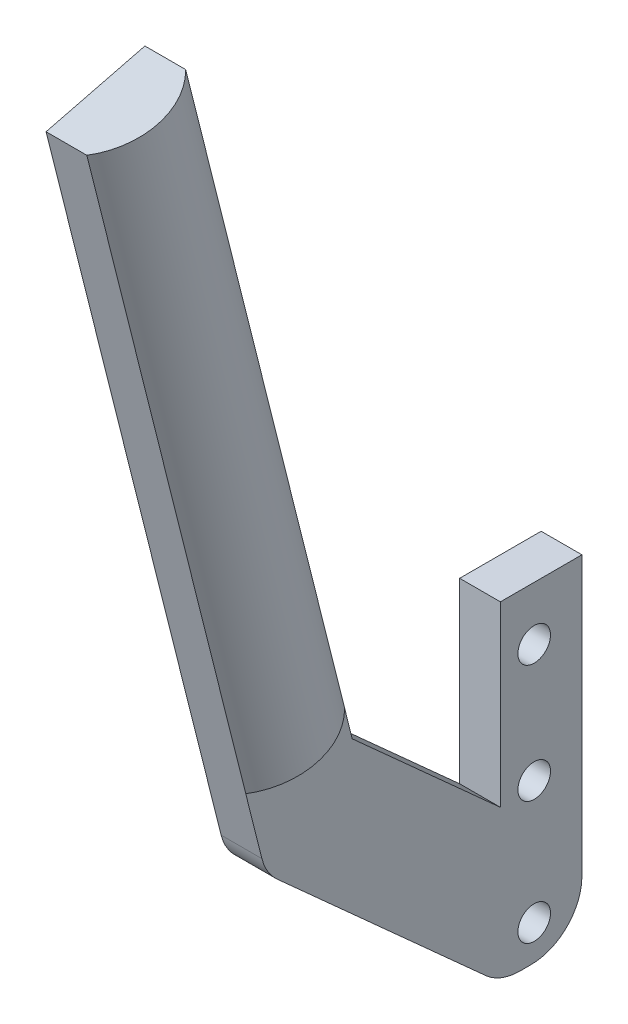
ISO-10303-21;
HEADER;
FILE_DESCRIPTION(('STEP AP214'),'2;1');
FILE_NAME('part.step','',(''),(''),'','','');
FILE_SCHEMA(('AUTOMOTIVE_DESIGN { 1 0 10303 214 1 1 1 1 }'));
ENDSEC;
DATA;
#1=APPLICATION_CONTEXT('core data for automotive mechanical design processes');
#2=APPLICATION_PROTOCOL_DEFINITION('international standard','automotive_design',2000,#1);
#3=PRODUCT_CONTEXT('',#1,'mechanical');
#4=PRODUCT('Part','Part','',(#3));
#5=PRODUCT_RELATED_PRODUCT_CATEGORY('part','',(#4));
#6=PRODUCT_DEFINITION_FORMATION('','',#4);
#7=PRODUCT_DEFINITION_CONTEXT('part definition',#1,'design');
#8=PRODUCT_DEFINITION('design','',#6,#7);
#9=PRODUCT_DEFINITION_SHAPE('','',#8);
#10=(LENGTH_UNIT() NAMED_UNIT(*) SI_UNIT(.MILLI.,.METRE.));
#11=(NAMED_UNIT(*) PLANE_ANGLE_UNIT() SI_UNIT($,.RADIAN.));
#12=(NAMED_UNIT(*) SI_UNIT($,.STERADIAN.) SOLID_ANGLE_UNIT());
#13=UNCERTAINTY_MEASURE_WITH_UNIT(LENGTH_MEASURE(1.E-05),#10,'distance_accuracy_value','');
#14=(GEOMETRIC_REPRESENTATION_CONTEXT(3) GLOBAL_UNCERTAINTY_ASSIGNED_CONTEXT((#13)) GLOBAL_UNIT_ASSIGNED_CONTEXT((#10,
#11,#12)) REPRESENTATION_CONTEXT('',''));
#15=CARTESIAN_POINT('',(0.,0.,0.));
#16=DIRECTION('',(0.,0.,1.));
#17=DIRECTION('',(1.,0.,0.));
#18=AXIS2_PLACEMENT_3D('',#15,#16,#17);
#19=CARTESIAN_POINT('',(13.5,-15.5,10.));
#20=DIRECTION('',(0.,-1.,0.));
#21=DIRECTION('',(1.,0.,0.));
#22=AXIS2_PLACEMENT_3D('',#19,#20,#21);
#23=PLANE('',#22);
#24=DIRECTION('',(0.,0.,-1.));
#25=VECTOR('',#24,1.);
#26=CARTESIAN_POINT('',(16.5,-15.5,10.));
#27=LINE('',#26,#25);
#28=CARTESIAN_POINT('',(16.5,-15.5,8.08085446230584));
#29=VERTEX_POINT('',#28);
#30=CARTESIAN_POINT('',(16.5,-15.5,7.));
#31=VERTEX_POINT('',#30);
#32=EDGE_CURVE('E250',#29,#31,#27,.T.);
#33=ORIENTED_EDGE('',*,*,#32,.T.);
#34=DIRECTION('',(-1.,0.,0.));
#35=VECTOR('',#34,1.);
#36=CARTESIAN_POINT('',(20.5,-15.5,7.));
#37=LINE('',#36,#35);
#38=CARTESIAN_POINT('',(20.5,-15.5,7.));
#39=VERTEX_POINT('',#38);
#40=EDGE_CURVE('E232',#31,#39,#37,.F.);
#41=ORIENTED_EDGE('',*,*,#40,.T.);
#42=DIRECTION('',(0.,0.,-1.));
#43=VECTOR('',#42,1.);
#44=CARTESIAN_POINT('',(20.5,-15.5,0.));
#45=LINE('',#44,#43);
#46=CARTESIAN_POINT('',(20.5,-15.5,8.08085446230584));
#47=VERTEX_POINT('',#46);
#48=EDGE_CURVE('E171',#47,#39,#45,.T.);
#49=ORIENTED_EDGE('',*,*,#48,.F.);
#50=DIRECTION('',(-1.,0.,0.));
#51=VECTOR('',#50,1.);
#52=CARTESIAN_POINT('',(13.5,-15.5,8.08085446230584));
#53=LINE('',#52,#51);
#54=EDGE_CURVE('E229',#47,#29,#53,.T.);
#55=ORIENTED_EDGE('',*,*,#54,.T.);
#56=EDGE_LOOP('',(#33,#41,#49,#55));
#57=FACE_BOUND('',#56,.T.);
#58=ADVANCED_FACE('F37',(#57),#23,.T.);
#59=CARTESIAN_POINT('',(-124.5,11.5751536993855,6.68185993922691));
#60=DIRECTION('',(1.,0.,0.));
#61=DIRECTION('',(0.,0.,-1.));
#62=AXIS2_PLACEMENT_3D('',#59,#60,#61);
#63=CYLINDRICAL_SURFACE('',#62,1.6);
#64=CARTESIAN_POINT('',(20.5,11.5751536993855,6.68185993922691));
#65=DIRECTION('',(1.,0.,0.));
#66=DIRECTION('',(0.,0.,-1.));
#67=AXIS2_PLACEMENT_3D('',#64,#65,#66);
#68=CIRCLE('',#67,1.6);
#69=CARTESIAN_POINT('',(20.5,11.5751536993855,5.08185993922691));
#70=VERTEX_POINT('',#69);
#71=EDGE_CURVE('E177',#70,#70,#68,.F.);
#72=ORIENTED_EDGE('',*,*,#71,.F.);
#73=EDGE_LOOP('',(#72));
#74=FACE_BOUND('',#73,.T.);
#75=CARTESIAN_POINT('',(16.5,11.5751536993855,6.68185993922691));
#76=DIRECTION('',(-1.,0.,0.));
#77=DIRECTION('',(0.,0.,1.));
#78=AXIS2_PLACEMENT_3D('',#75,#76,#77);
#79=CIRCLE('',#78,1.6);
#80=CARTESIAN_POINT('',(16.5,11.5751536993855,8.28185993922691));
#81=VERTEX_POINT('',#80);
#82=EDGE_CURVE('E188',#81,#81,#79,.F.);
#83=ORIENTED_EDGE('',*,*,#82,.F.);
#84=EDGE_LOOP('',(#83));
#85=FACE_BOUND('',#84,.T.);
#86=ADVANCED_FACE('F302',(#74,#85),#63,.F.);
#87=CARTESIAN_POINT('',(-124.5,-12.0698183873928,6.68185993922691));
#88=DIRECTION('',(1.,0.,0.));
#89=DIRECTION('',(0.,0.,-1.));
#90=AXIS2_PLACEMENT_3D('',#87,#88,#89);
#91=CYLINDRICAL_SURFACE('',#90,1.6);
#92=CARTESIAN_POINT('',(20.5,-12.0698183873928,6.68185993922691));
#93=DIRECTION('',(1.,0.,0.));
#94=DIRECTION('',(0.,0.,-1.));
#95=AXIS2_PLACEMENT_3D('',#92,#93,#94);
#96=CIRCLE('',#95,1.6);
#97=CARTESIAN_POINT('',(20.5,-12.0698183873928,5.08185993922691));
#98=VERTEX_POINT('',#97);
#99=EDGE_CURVE('E198',#98,#98,#96,.F.);
#100=ORIENTED_EDGE('',*,*,#99,.F.);
#101=EDGE_LOOP('',(#100));
#102=FACE_BOUND('',#101,.T.);
#103=CARTESIAN_POINT('',(16.5,-12.0698183873928,6.68185993922691));
#104=DIRECTION('',(-1.,0.,0.));
#105=DIRECTION('',(0.,0.,1.));
#106=AXIS2_PLACEMENT_3D('',#103,#104,#105);
#107=CIRCLE('',#106,1.6);
#108=CARTESIAN_POINT('',(16.5,-12.0698183873928,8.28185993922691));
#109=VERTEX_POINT('',#108);
#110=EDGE_CURVE('E289',#109,#109,#107,.F.);
#111=ORIENTED_EDGE('',*,*,#110,.F.);
#112=EDGE_LOOP('',(#111));
#113=FACE_BOUND('',#112,.T.);
#114=ADVANCED_FACE('F298',(#102,#113),#91,.F.);
#115=CARTESIAN_POINT('',(-124.5,0.,6.68185993922691));
#116=DIRECTION('',(1.,0.,0.));
#117=DIRECTION('',(0.,0.,-1.));
#118=AXIS2_PLACEMENT_3D('',#115,#116,#117);
#119=CYLINDRICAL_SURFACE('',#118,1.6);
#120=CARTESIAN_POINT('',(20.5,0.,6.68185993922691));
#121=DIRECTION('',(1.,0.,0.));
#122=DIRECTION('',(0.,0.,-1.));
#123=AXIS2_PLACEMENT_3D('',#120,#121,#122);
#124=CIRCLE('',#123,1.6);
#125=CARTESIAN_POINT('',(20.5,0.,5.08185993922691));
#126=VERTEX_POINT('',#125);
#127=EDGE_CURVE('E180',#126,#126,#124,.F.);
#128=ORIENTED_EDGE('',*,*,#127,.F.);
#129=EDGE_LOOP('',(#128));
#130=FACE_BOUND('',#129,.T.);
#131=CARTESIAN_POINT('',(16.5,0.,6.68185993922691));
#132=DIRECTION('',(-1.,0.,0.));
#133=DIRECTION('',(0.,0.,1.));
#134=AXIS2_PLACEMENT_3D('',#131,#132,#133);
#135=CIRCLE('',#134,1.6);
#136=CARTESIAN_POINT('',(16.5,0.,8.28185993922691));
#137=VERTEX_POINT('',#136);
#138=EDGE_CURVE('E286',#137,#137,#135,.F.);
#139=ORIENTED_EDGE('',*,*,#138,.F.);
#140=EDGE_LOOP('',(#139));
#141=FACE_BOUND('',#140,.T.);
#142=ADVANCED_FACE('F301',(#130,#141),#119,.F.);
#143=CARTESIAN_POINT('',(20.5,0.,10.));
#144=DIRECTION('',(0.,0.,-1.));
#145=DIRECTION('',(-1.,0.,0.));
#146=AXIS2_PLACEMENT_3D('',#143,#144,#145);
#147=PLANE('',#146);
#148=DIRECTION('',(0.,-1.,0.));
#149=VECTOR('',#148,1.);
#150=CARTESIAN_POINT('',(16.5,15.5,10.));
#151=LINE('',#150,#149);
#152=CARTESIAN_POINT('',(16.5,16.8452873223447,10.));
#153=VERTEX_POINT('',#152);
#154=CARTESIAN_POINT('',(16.5,-0.619784933226779,10.));
#155=VERTEX_POINT('',#154);
#156=EDGE_CURVE('E212',#153,#155,#151,.T.);
#157=ORIENTED_EDGE('',*,*,#156,.T.);
#158=DIRECTION('',(-1.,0.,0.));
#159=VECTOR('',#158,1.);
#160=CARTESIAN_POINT('',(20.5,-0.619784933226779,10.));
#161=LINE('',#160,#159);
#162=CARTESIAN_POINT('',(20.5,-0.619784933226779,10.));
#163=VERTEX_POINT('',#162);
#164=EDGE_CURVE('E210',#163,#155,#161,.T.);
#165=ORIENTED_EDGE('',*,*,#164,.F.);
#166=DIRECTION('',(0.,-1.,0.));
#167=VECTOR('',#166,1.);
#168=CARTESIAN_POINT('',(20.5,0.,10.));
#169=LINE('',#168,#167);
#170=CARTESIAN_POINT('',(20.5,16.8452873223447,10.));
#171=VERTEX_POINT('',#170);
#172=EDGE_CURVE('E271',#171,#163,#169,.T.);
#173=ORIENTED_EDGE('',*,*,#172,.F.);
#174=DIRECTION('',(-1.,0.,0.));
#175=VECTOR('',#174,1.);
#176=CARTESIAN_POINT('',(20.5,16.8452873223447,10.));
#177=LINE('',#176,#175);
#178=EDGE_CURVE('E183',#171,#153,#177,.T.);
#179=ORIENTED_EDGE('',*,*,#178,.T.);
#180=EDGE_LOOP('',(#157,#165,#173,#179));
#181=FACE_BOUND('',#180,.T.);
#182=ADVANCED_FACE('F274',(#181),#147,.F.);
#183=CARTESIAN_POINT('',(20.5,-5.31486837665205,4.784943075451));
#184=DIRECTION('',(0.,0.743185563713064,-0.669085359194547));
#185=DIRECTION('',(0.,0.669085359194547,0.743185563713064));
#186=AXIS2_PLACEMENT_3D('',#183,#184,#185);
#187=PLANE('',#186);
#188=DIRECTION('',(0.,-0.669085359194547,-0.743185563713064));
#189=VECTOR('',#188,1.);
#190=CARTESIAN_POINT('',(16.5,-5.31486837665205,4.784943075451));
#191=LINE('',#190,#189);
#192=CARTESIAN_POINT('',(16.5,12.4720171727406,24.5416996418154));
#193=VERTEX_POINT('',#192);
#194=EDGE_CURVE('E184',#193,#155,#191,.T.);
#195=ORIENTED_EDGE('',*,*,#194,.F.);
#196=DIRECTION('',(-1.,0.,0.));
#197=VECTOR('',#196,1.);
#198=CARTESIAN_POINT('',(20.5,12.4720171727406,24.5416996418154));
#199=LINE('',#198,#197);
#200=CARTESIAN_POINT('',(20.5,12.4720171727406,24.5416996418154));
#201=VERTEX_POINT('',#200);
#202=EDGE_CURVE('E208',#201,#193,#199,.T.);
#203=ORIENTED_EDGE('',*,*,#202,.F.);
#204=DIRECTION('',(0.,-0.669085359194547,-0.743185563713064));
#205=VECTOR('',#204,1.);
#206=CARTESIAN_POINT('',(20.5,-5.31486837665205,4.784943075451));
#207=LINE('',#206,#205);
#208=EDGE_CURVE('E156',#201,#163,#207,.T.);
#209=ORIENTED_EDGE('',*,*,#208,.T.);
#210=ORIENTED_EDGE('',*,*,#164,.T.);
#211=EDGE_LOOP('',(#195,#203,#209,#210));
#212=FACE_BOUND('',#211,.T.);
#213=ADVANCED_FACE('F277',(#212),#187,.T.);
#214=CARTESIAN_POINT('',(20.5,-5.05991369015755,20.136197768659));
#215=DIRECTION('',(0.,0.243707906273157,-0.969848677072849));
#216=DIRECTION('',(0.,0.969848677072849,0.243707906273157));
#217=AXIS2_PLACEMENT_3D('',#214,#215,#216);
#218=PLANE('',#217);
#219=DIRECTION('',(0.,-0.969848677072848,-0.243707906273157));
#220=VECTOR('',#219,1.);
#221=CARTESIAN_POINT('',(16.5,-5.05991369015755,20.136197768659));
#222=LINE('',#221,#220);
#223=CARTESIAN_POINT('',(16.5,77.5343188438326,40.8908453306364));
#224=VERTEX_POINT('',#223);
#225=EDGE_CURVE('E187',#224,#193,#222,.T.);
#226=ORIENTED_EDGE('',*,*,#225,.F.);
#227=DIRECTION('',(-1.,0.,0.));
#228=VECTOR('',#227,1.);
#229=CARTESIAN_POINT('',(20.5,77.5343188438326,40.8908453306364));
#230=LINE('',#229,#228);
#231=CARTESIAN_POINT('',(20.5,77.5343188438326,40.8908453306364));
#232=VERTEX_POINT('',#231);
#233=EDGE_CURVE('E163',#232,#224,#230,.T.);
#234=ORIENTED_EDGE('',*,*,#233,.F.);
#235=DIRECTION('',(0.,-0.969848677072848,-0.243707906273157));
#236=VECTOR('',#235,1.);
#237=CARTESIAN_POINT('',(20.5,-5.05991369015755,20.136197768659));
#238=LINE('',#237,#236);
#239=CARTESIAN_POINT('',(20.5,15.4640035111703,25.2935393291544));
#240=VERTEX_POINT('',#239);
#241=EDGE_CURVE('E138',#232,#240,#238,.T.);
#242=ORIENTED_EDGE('',*,*,#241,.T.);
#243=EDGE_CURVE('E151',#240,#201,#238,.T.);
#244=ORIENTED_EDGE('',*,*,#243,.T.);
#245=ORIENTED_EDGE('',*,*,#202,.T.);
#246=EDGE_LOOP('',(#226,#234,#242,#244,#245));
#247=FACE_BOUND('',#246,.T.);
#248=ADVANCED_FACE('F162',(#247),#218,.T.);
#249=CARTESIAN_POINT('',(20.5,82.5942325339901,20.7546475619774));
#250=DIRECTION('',(0.,0.969848677072848,0.243707906273157));
#251=DIRECTION('',(0.,-0.243707906273157,0.969848677072848));
#252=AXIS2_PLACEMENT_3D('',#249,#250,#251);
#253=PLANE('',#252);
#254=DIRECTION('',(0.,0.243707906273157,-0.969848677072848));
#255=VECTOR('',#254,1.);
#256=CARTESIAN_POINT('',(16.5,82.5942325339901,20.7546475619774));
#257=LINE('',#256,#255);
#258=CARTESIAN_POINT('',(16.5,75.097239781101,50.5893321013648));
#259=VERTEX_POINT('',#258);
#260=EDGE_CURVE('E190',#259,#224,#257,.T.);
#261=ORIENTED_EDGE('',*,*,#260,.F.);
#262=DIRECTION('',(-1.,0.,0.));
#263=VECTOR('',#262,1.);
#264=CARTESIAN_POINT('',(20.5,75.097239781101,50.5893321013648));
#265=LINE('',#264,#263);
#266=CARTESIAN_POINT('',(20.5,75.097239781101,50.5893321013648));
#267=VERTEX_POINT('',#266);
#268=EDGE_CURVE('E204',#267,#259,#265,.T.);
#269=ORIENTED_EDGE('',*,*,#268,.F.);
#270=CARTESIAN_POINT('',(15.5,76.3157793124668,45.7400887160006));
#271=DIRECTION('',(0.,0.969848677072848,0.243707906273157));
#272=DIRECTION('',(0.,0.243707906273157,-0.969848677072848));
#273=AXIS2_PLACEMENT_3D('',#270,#271,#272);
#274=CIRCLE('',#273,7.07106781186543);
#275=EDGE_CURVE('E145',#267,#232,#274,.T.);
#276=ORIENTED_EDGE('',*,*,#275,.T.);
#277=ORIENTED_EDGE('',*,*,#233,.T.);
#278=EDGE_LOOP('',(#261,#269,#276,#277));
#279=FACE_BOUND('',#278,.T.);
#280=ADVANCED_FACE('F281',(#279),#253,.T.);
#281=CARTESIAN_POINT('',(20.5,-7.4969927528891,29.8346845393875));
#282=DIRECTION('',(0.,-0.243707906273156,0.969848677072849));
#283=DIRECTION('',(0.,-0.969848677072849,-0.243707906273156));
#284=AXIS2_PLACEMENT_3D('',#281,#282,#283);
#285=PLANE('',#284);
#286=DIRECTION('',(0.,0.969848677072849,0.243707906273156));
#287=VECTOR('',#286,1.);
#288=CARTESIAN_POINT('',(16.5,-7.4969927528891,29.8346845393875));
#289=LINE('',#288,#287);
#290=CARTESIAN_POINT('',(16.5,6.71594614852708,33.4061752920549));
#291=VERTEX_POINT('',#290);
#292=EDGE_CURVE('E193',#291,#259,#289,.T.);
#293=ORIENTED_EDGE('',*,*,#292,.F.);
#294=DIRECTION('',(-1.,0.,0.));
#295=VECTOR('',#294,1.);
#296=CARTESIAN_POINT('',(20.5,6.71594614852707,33.4061752920549));
#297=LINE('',#296,#295);
#298=CARTESIAN_POINT('',(20.5,6.71594614852708,33.4061752920549));
#299=VERTEX_POINT('',#298);
#300=EDGE_CURVE('E11',#291,#299,#297,.F.);
#301=ORIENTED_EDGE('',*,*,#300,.T.);
#302=DIRECTION('',(0.,0.969848677072849,0.243707906273156));
#303=VECTOR('',#302,1.);
#304=CARTESIAN_POINT('',(20.5,-7.4969927528891,29.8346845393875));
#305=LINE('',#304,#303);
#306=CARTESIAN_POINT('',(20.5,13.0269244484387,34.9920260998828));
#307=VERTEX_POINT('',#306);
#308=EDGE_CURVE('E164',#299,#307,#305,.T.);
#309=ORIENTED_EDGE('',*,*,#308,.T.);
#310=DIRECTION('',(0.,0.969848677072848,0.243707906273157));
#311=VECTOR('',#310,1.);
#312=CARTESIAN_POINT('',(20.5,13.0269244484387,34.9920260998828));
#313=LINE('',#312,#311);
#314=EDGE_CURVE('E141',#307,#267,#313,.T.);
#315=ORIENTED_EDGE('',*,*,#314,.T.);
#316=ORIENTED_EDGE('',*,*,#268,.T.);
#317=EDGE_LOOP('',(#293,#301,#309,#315,#316));
#318=FACE_BOUND('',#317,.T.);
#319=ADVANCED_FACE('F330',(#318),#285,.T.);
#320=CARTESIAN_POINT('',(20.5,-13.5335799211799,12.1841981664849));
#321=DIRECTION('',(0.,-0.743185563713064,0.669085359194547));
#322=DIRECTION('',(0.,-0.669085359194547,-0.743185563713064));
#323=AXIS2_PLACEMENT_3D('',#320,#321,#322);
#324=PLANE('',#323);
#325=DIRECTION('',(0.,0.669085359194547,0.743185563713064));
#326=VECTOR('',#325,1.);
#327=CARTESIAN_POINT('',(20.5,-13.5335799211799,12.1841981664849));
#328=LINE('',#327,#326);
#329=CARTESIAN_POINT('',(20.5,-14.2159278185653,11.4262812582786));
#330=VERTEX_POINT('',#329);
#331=CARTESIAN_POINT('',(20.5,4.21855786132754,31.9023587026634));
#332=VERTEX_POINT('',#331);
#333=EDGE_CURVE('E165',#330,#332,#328,.T.);
#334=ORIENTED_EDGE('',*,*,#333,.T.);
#335=DIRECTION('',(-1.,0.,0.));
#336=VECTOR('',#335,1.);
#337=CARTESIAN_POINT('',(20.5,4.21855786132754,31.9023587026634));
#338=LINE('',#337,#336);
#339=CARTESIAN_POINT('',(16.5,4.21855786132754,31.9023587026634));
#340=VERTEX_POINT('',#339);
#341=EDGE_CURVE('E45',#332,#340,#338,.T.);
#342=ORIENTED_EDGE('',*,*,#341,.T.);
#343=DIRECTION('',(0.,0.669085359194547,0.743185563713064));
#344=VECTOR('',#343,1.);
#345=CARTESIAN_POINT('',(16.5,-13.5335799211799,12.1841981664849));
#346=LINE('',#345,#344);
#347=CARTESIAN_POINT('',(16.5,-14.2159278185653,11.4262812582786));
#348=VERTEX_POINT('',#347);
#349=EDGE_CURVE('E195',#348,#340,#346,.T.);
#350=ORIENTED_EDGE('',*,*,#349,.F.);
#351=DIRECTION('',(-1.,0.,0.));
#352=VECTOR('',#351,1.);
#353=CARTESIAN_POINT('',(20.5,-14.2159278185653,11.4262812582786));
#354=LINE('',#353,#352);
#355=EDGE_CURVE('E59',#348,#330,#354,.F.);
#356=ORIENTED_EDGE('',*,*,#355,.T.);
#357=EDGE_LOOP('',(#334,#342,#350,#356));
#358=FACE_BOUND('',#357,.T.);
#359=ADVANCED_FACE('F241',(#358),#324,.T.);
#360=CARTESIAN_POINT('',(20.5,0.,2.));
#361=DIRECTION('',(0.,0.,1.));
#362=DIRECTION('',(1.,0.,0.));
#363=AXIS2_PLACEMENT_3D('',#360,#361,#362);
#364=PLANE('',#363);
#365=DIRECTION('',(0.,1.,0.));
#366=VECTOR('',#365,1.);
#367=CARTESIAN_POINT('',(20.5,0.,2.));
#368=LINE('',#367,#366);
#369=CARTESIAN_POINT('',(20.5,-10.5,2.));
#370=VERTEX_POINT('',#369);
#371=CARTESIAN_POINT('',(20.5,16.8452873223447,2.));
#372=VERTEX_POINT('',#371);
#373=EDGE_CURVE('E173',#370,#372,#368,.T.);
#374=ORIENTED_EDGE('',*,*,#373,.F.);
#375=DIRECTION('',(-1.,0.,0.));
#376=VECTOR('',#375,1.);
#377=CARTESIAN_POINT('',(16.5,-10.5,2.));
#378=LINE('',#377,#376);
#379=CARTESIAN_POINT('',(16.5,-10.5,2.));
#380=VERTEX_POINT('',#379);
#381=EDGE_CURVE('E220',#370,#380,#378,.T.);
#382=ORIENTED_EDGE('',*,*,#381,.T.);
#383=DIRECTION('',(0.,-1.,0.));
#384=VECTOR('',#383,1.);
#385=CARTESIAN_POINT('',(16.5,16.8452873223447,2.));
#386=LINE('',#385,#384);
#387=CARTESIAN_POINT('',(16.5,16.8452873223447,2.));
#388=VERTEX_POINT('',#387);
#389=EDGE_CURVE('E218',#380,#388,#386,.F.);
#390=ORIENTED_EDGE('',*,*,#389,.T.);
#391=DIRECTION('',(-1.,0.,0.));
#392=VECTOR('',#391,1.);
#393=CARTESIAN_POINT('',(20.5,16.8452873223447,2.));
#394=LINE('',#393,#392);
#395=EDGE_CURVE('E201',#372,#388,#394,.T.);
#396=ORIENTED_EDGE('',*,*,#395,.F.);
#397=EDGE_LOOP('',(#374,#382,#390,#396));
#398=FACE_BOUND('',#397,.T.);
#399=ADVANCED_FACE('F263',(#398),#364,.F.);
#400=CARTESIAN_POINT('',(20.5,16.8452873223447,0.));
#401=DIRECTION('',(0.,-1.,0.));
#402=DIRECTION('',(0.,0.,-1.));
#403=AXIS2_PLACEMENT_3D('',#400,#401,#402);
#404=PLANE('',#403);
#405=DIRECTION('',(0.,0.,-1.));
#406=VECTOR('',#405,1.);
#407=CARTESIAN_POINT('',(16.5,16.8452873223447,10.));
#408=LINE('',#407,#406);
#409=EDGE_CURVE('E215',#388,#153,#408,.F.);
#410=ORIENTED_EDGE('',*,*,#409,.T.);
#411=ORIENTED_EDGE('',*,*,#178,.F.);
#412=DIRECTION('',(0.,0.,1.));
#413=VECTOR('',#412,1.);
#414=CARTESIAN_POINT('',(20.5,16.8452873223447,0.));
#415=LINE('',#414,#413);
#416=EDGE_CURVE('E175',#372,#171,#415,.T.);
#417=ORIENTED_EDGE('',*,*,#416,.F.);
#418=ORIENTED_EDGE('',*,*,#395,.T.);
#419=EDGE_LOOP('',(#410,#411,#417,#418));
#420=FACE_BOUND('',#419,.T.);
#421=ADVANCED_FACE('F269',(#420),#404,.F.);
#422=CARTESIAN_POINT('',(20.5,0.,0.));
#423=DIRECTION('',(1.,0.,0.));
#424=DIRECTION('',(0.,0.,-1.));
#425=AXIS2_PLACEMENT_3D('',#422,#423,#424);
#426=PLANE('',#425);
#427=ORIENTED_EDGE('',*,*,#48,.T.);
#428=CARTESIAN_POINT('',(20.5,-10.5,7.));
#429=DIRECTION('',(1.,0.,0.));
#430=DIRECTION('',(0.,0.,-1.));
#431=AXIS2_PLACEMENT_3D('',#428,#429,#430);
#432=CIRCLE('',#431,5.);
#433=EDGE_CURVE('E237',#39,#370,#432,.T.);
#434=ORIENTED_EDGE('',*,*,#433,.T.);
#435=ORIENTED_EDGE('',*,*,#373,.T.);
#436=ORIENTED_EDGE('',*,*,#416,.T.);
#437=ORIENTED_EDGE('',*,*,#172,.T.);
#438=ORIENTED_EDGE('',*,*,#208,.F.);
#439=ORIENTED_EDGE('',*,*,#243,.F.);
#440=DIRECTION('',(0.,-0.243707906273158,0.969848677072848));
#441=VECTOR('',#440,1.);
#442=CARTESIAN_POINT('',(20.5,15.4640035111703,25.2935393291544));
#443=LINE('',#442,#441);
#444=EDGE_CURVE('E144',#240,#307,#443,.T.);
#445=ORIENTED_EDGE('',*,*,#444,.T.);
#446=ORIENTED_EDGE('',*,*,#308,.F.);
#447=CARTESIAN_POINT('',(20.5,7.93448567989286,28.5569319066907));
#448=DIRECTION('',(1.,0.,0.));
#449=DIRECTION('',(0.,0.,-1.));
#450=AXIS2_PLACEMENT_3D('',#447,#448,#449);
#451=CIRCLE('',#450,5.);
#452=EDGE_CURVE('E52',#299,#332,#451,.T.);
#453=ORIENTED_EDGE('',*,*,#452,.T.);
#454=ORIENTED_EDGE('',*,*,#333,.F.);
#455=CARTESIAN_POINT('',(20.5,-10.5,8.08085446230585));
#456=DIRECTION('',(1.,0.,0.));
#457=DIRECTION('',(0.,0.,-1.));
#458=AXIS2_PLACEMENT_3D('',#455,#456,#457);
#459=CIRCLE('',#458,5.);
#460=EDGE_CURVE('E234',#330,#47,#459,.T.);
#461=ORIENTED_EDGE('',*,*,#460,.T.);
#462=EDGE_LOOP('',(#427,#434,#435,#436,#437,#438,#439,#445,#446,#453,#454,#461));
#463=FACE_BOUND('',#462,.T.);
#464=ORIENTED_EDGE('',*,*,#99,.T.);
#465=EDGE_LOOP('',(#464));
#466=FACE_BOUND('',#465,.T.);
#467=ORIENTED_EDGE('',*,*,#71,.T.);
#468=EDGE_LOOP('',(#467));
#469=FACE_BOUND('',#468,.T.);
#470=ORIENTED_EDGE('',*,*,#127,.T.);
#471=EDGE_LOOP('',(#470));
#472=FACE_BOUND('',#471,.T.);
#473=ADVANCED_FACE('F153',(#463,#466,#469,#472),#426,.T.);
#474=CARTESIAN_POINT('',(16.5,0.,0.));
#475=DIRECTION('',(1.,0.,0.));
#476=DIRECTION('',(0.,0.,-1.));
#477=AXIS2_PLACEMENT_3D('',#474,#475,#476);
#478=PLANE('',#477);
#479=ORIENTED_EDGE('',*,*,#389,.F.);
#480=CARTESIAN_POINT('',(16.5,-10.5,7.));
#481=DIRECTION('',(1.,0.,0.));
#482=DIRECTION('',(0.,0.,-1.));
#483=AXIS2_PLACEMENT_3D('',#480,#481,#482);
#484=CIRCLE('',#483,5.);
#485=EDGE_CURVE('E227',#380,#31,#484,.F.);
#486=ORIENTED_EDGE('',*,*,#485,.T.);
#487=ORIENTED_EDGE('',*,*,#32,.F.);
#488=CARTESIAN_POINT('',(16.5,-10.5,8.08085446230584));
#489=DIRECTION('',(1.,0.,0.));
#490=DIRECTION('',(0.,0.,-1.));
#491=AXIS2_PLACEMENT_3D('',#488,#489,#490);
#492=CIRCLE('',#491,5.);
#493=EDGE_CURVE('E223',#29,#348,#492,.F.);
#494=ORIENTED_EDGE('',*,*,#493,.T.);
#495=ORIENTED_EDGE('',*,*,#349,.T.);
#496=CARTESIAN_POINT('',(16.5,7.93448567989286,28.5569319066907));
#497=DIRECTION('',(1.,0.,0.));
#498=DIRECTION('',(0.,0.,-1.));
#499=AXIS2_PLACEMENT_3D('',#496,#497,#498);
#500=CIRCLE('',#499,5.);
#501=EDGE_CURVE('E225',#340,#291,#500,.F.);
#502=ORIENTED_EDGE('',*,*,#501,.T.);
#503=ORIENTED_EDGE('',*,*,#292,.T.);
#504=ORIENTED_EDGE('',*,*,#260,.T.);
#505=ORIENTED_EDGE('',*,*,#225,.T.);
#506=ORIENTED_EDGE('',*,*,#194,.T.);
#507=ORIENTED_EDGE('',*,*,#156,.F.);
#508=ORIENTED_EDGE('',*,*,#409,.F.);
#509=EDGE_LOOP('',(#479,#486,#487,#494,#495,#502,#503,#504,#505,#506,#507,#508));
#510=FACE_BOUND('',#509,.T.);
#511=ORIENTED_EDGE('',*,*,#138,.T.);
#512=EDGE_LOOP('',(#511));
#513=FACE_BOUND('',#512,.T.);
#514=ORIENTED_EDGE('',*,*,#110,.T.);
#515=EDGE_LOOP('',(#514));
#516=FACE_BOUND('',#515,.T.);
#517=ORIENTED_EDGE('',*,*,#82,.T.);
#518=EDGE_LOOP('',(#517));
#519=FACE_BOUND('',#518,.T.);
#520=ADVANCED_FACE('F245',(#510,#513,#516,#519),#478,.F.);
#521=CARTESIAN_POINT('',(15.5,14.2454639798045,30.1427827145186));
#522=DIRECTION('',(0.,0.969848677072848,0.243707906273157));
#523=DIRECTION('',(0.,-0.243707906273157,0.969848677072848));
#524=AXIS2_PLACEMENT_3D('',#521,#522,#523);
#525=CYLINDRICAL_SURFACE('',#524,7.07106781186543);
#526=ORIENTED_EDGE('',*,*,#275,.F.);
#527=ORIENTED_EDGE('',*,*,#314,.F.);
#528=CARTESIAN_POINT('',(15.5,14.2454639798045,30.1427827145186));
#529=DIRECTION('',(0.,0.969848677072848,0.243707906273157));
#530=DIRECTION('',(0.,0.243707906273157,-0.969848677072848));
#531=AXIS2_PLACEMENT_3D('',#528,#529,#530);
#532=CIRCLE('',#531,7.07106781186543);
#533=EDGE_CURVE('E134',#307,#240,#532,.T.);
#534=ORIENTED_EDGE('',*,*,#533,.T.);
#535=ORIENTED_EDGE('',*,*,#241,.F.);
#536=EDGE_LOOP('',(#526,#527,#534,#535));
#537=FACE_BOUND('',#536,.T.);
#538=ADVANCED_FACE('F136',(#537),#525,.T.);
#539=CARTESIAN_POINT('',(15.5,14.2454639798045,30.1427827145186));
#540=DIRECTION('',(0.,-0.969848677072848,-0.243707906273157));
#541=DIRECTION('',(0.,0.243707906273157,-0.969848677072848));
#542=AXIS2_PLACEMENT_3D('',#539,#540,#541);
#543=PLANE('',#542);
#544=ORIENTED_EDGE('',*,*,#533,.F.);
#545=ORIENTED_EDGE('',*,*,#444,.F.);
#546=EDGE_LOOP('',(#544,#545));
#547=FACE_BOUND('',#546,.T.);
#548=ADVANCED_FACE('F148',(#547),#543,.T.);
#549=CARTESIAN_POINT('',(20.5,-10.5,7.));
#550=DIRECTION('',(1.,0.,0.));
#551=DIRECTION('',(0.,1.,0.));
#552=AXIS2_PLACEMENT_3D('',#549,#550,#551);
#553=CYLINDRICAL_SURFACE('',#552,5.);
#554=ORIENTED_EDGE('',*,*,#433,.F.);
#555=ORIENTED_EDGE('',*,*,#40,.F.);
#556=ORIENTED_EDGE('',*,*,#485,.F.);
#557=ORIENTED_EDGE('',*,*,#381,.F.);
#558=EDGE_LOOP('',(#554,#555,#556,#557));
#559=FACE_BOUND('',#558,.T.);
#560=ADVANCED_FACE('F261',(#559),#553,.T.);
#561=CARTESIAN_POINT('',(20.5,7.93448567989286,28.5569319066907));
#562=DIRECTION('',(-1.,0.,0.));
#563=DIRECTION('',(0.,0.,1.));
#564=AXIS2_PLACEMENT_3D('',#561,#562,#563);
#565=CYLINDRICAL_SURFACE('',#564,5.);
#566=ORIENTED_EDGE('',*,*,#452,.F.);
#567=ORIENTED_EDGE('',*,*,#300,.F.);
#568=ORIENTED_EDGE('',*,*,#501,.F.);
#569=ORIENTED_EDGE('',*,*,#341,.F.);
#570=EDGE_LOOP('',(#566,#567,#568,#569));
#571=FACE_BOUND('',#570,.T.);
#572=ADVANCED_FACE('F323',(#571),#565,.T.);
#573=CARTESIAN_POINT('',(13.5,-10.5,8.08085446230584));
#574=DIRECTION('',(-1.,0.,0.));
#575=DIRECTION('',(0.,0.,1.));
#576=AXIS2_PLACEMENT_3D('',#573,#574,#575);
#577=CYLINDRICAL_SURFACE('',#576,5.);
#578=ORIENTED_EDGE('',*,*,#460,.F.);
#579=ORIENTED_EDGE('',*,*,#355,.F.);
#580=ORIENTED_EDGE('',*,*,#493,.F.);
#581=ORIENTED_EDGE('',*,*,#54,.F.);
#582=EDGE_LOOP('',(#578,#579,#580,#581));
#583=FACE_BOUND('',#582,.T.);
#584=ADVANCED_FACE('F39',(#583),#577,.T.);
#585=CLOSED_SHELL('',(#58,#86,#114,#142,#182,#213,#248,#280,#319,#359,#399,#421,#473,#520,#538,
#548,#560,#572,#584));
#586=MANIFOLD_SOLID_BREP('B2',#585);
#587=ADVANCED_BREP_SHAPE_REPRESENTATION('',(#18,#586),#14);
#588=SHAPE_DEFINITION_REPRESENTATION(#9,#587);
ENDSEC;
END-ISO-10303-21;
